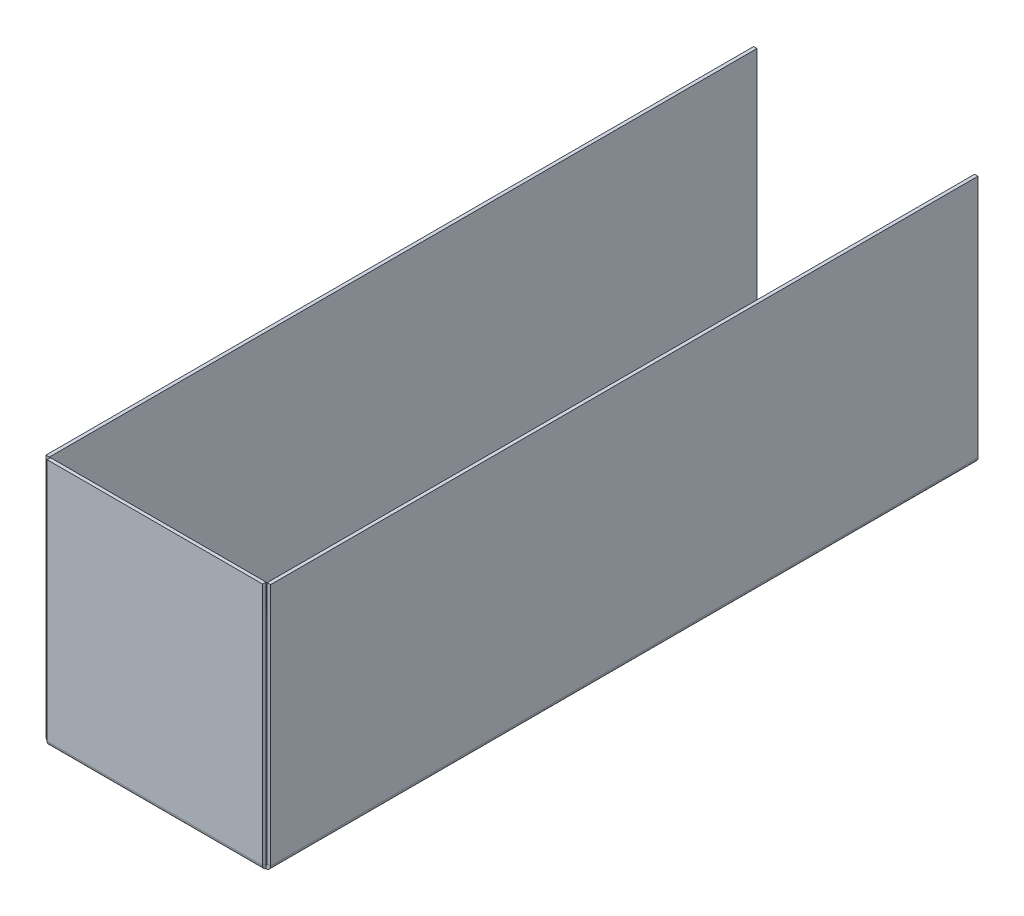
ISO-10303-21;
HEADER;
FILE_DESCRIPTION(('STEP AP214'),'2;1');
FILE_NAME('part.step','',(''),(''),'','','');
FILE_SCHEMA(('AUTOMOTIVE_DESIGN { 1 0 10303 214 1 1 1 1 }'));
ENDSEC;
DATA;
#1=APPLICATION_CONTEXT('core data for automotive mechanical design processes');
#2=APPLICATION_PROTOCOL_DEFINITION('international standard','automotive_design',2000,#1);
#3=PRODUCT_CONTEXT('',#1,'mechanical');
#4=PRODUCT('Part','Part','',(#3));
#5=PRODUCT_RELATED_PRODUCT_CATEGORY('part','',(#4));
#6=PRODUCT_DEFINITION_FORMATION('','',#4);
#7=PRODUCT_DEFINITION_CONTEXT('part definition',#1,'design');
#8=PRODUCT_DEFINITION('design','',#6,#7);
#9=PRODUCT_DEFINITION_SHAPE('','',#8);
#10=(LENGTH_UNIT() NAMED_UNIT(*) SI_UNIT(.MILLI.,.METRE.));
#11=(NAMED_UNIT(*) PLANE_ANGLE_UNIT() SI_UNIT($,.RADIAN.));
#12=(NAMED_UNIT(*) SI_UNIT($,.STERADIAN.) SOLID_ANGLE_UNIT());
#13=UNCERTAINTY_MEASURE_WITH_UNIT(LENGTH_MEASURE(1.E-05),#10,'distance_accuracy_value','');
#14=(GEOMETRIC_REPRESENTATION_CONTEXT(3) GLOBAL_UNCERTAINTY_ASSIGNED_CONTEXT((#13)) GLOBAL_UNIT_ASSIGNED_CONTEXT((#10,
#11,#12)) REPRESENTATION_CONTEXT('',''));
#15=CARTESIAN_POINT('',(0.,0.,0.));
#16=DIRECTION('',(0.,0.,1.));
#17=DIRECTION('',(1.,0.,0.));
#18=AXIS2_PLACEMENT_3D('',#15,#16,#17);
#19=CARTESIAN_POINT('',(167.362147713562,0.,660.4));
#20=DIRECTION('',(-1.,0.,0.));
#21=DIRECTION('',(0.,0.,1.));
#22=AXIS2_PLACEMENT_3D('',#19,#20,#21);
#23=PLANE('',#22);
#24=DIRECTION('',(0.,1.,0.));
#25=VECTOR('',#24,1.);
#26=CARTESIAN_POINT('',(167.362147713562,-3.175,660.4));
#27=LINE('',#26,#25);
#28=CARTESIAN_POINT('',(167.362147713562,-3.175,660.4));
#29=VERTEX_POINT('',#28);
#30=CARTESIAN_POINT('',(167.362147713562,-3.0534707350615,660.4));
#31=VERTEX_POINT('',#30);
#32=EDGE_CURVE('E228',#29,#31,#27,.T.);
#33=ORIENTED_EDGE('',*,*,#32,.T.);
#34=CARTESIAN_POINT('',(167.362147713562,1.,659.4));
#35=DIRECTION('',(1.,0.,0.));
#36=DIRECTION('',(0.,0.,-1.));
#37=AXIS2_PLACEMENT_3D('',#34,#35,#36);
#38=CIRCLE('',#37,4.175);
#39=CARTESIAN_POINT('',(167.362147713562,-3.175,659.4));
#40=VERTEX_POINT('',#39);
#41=EDGE_CURVE('E11',#31,#40,#38,.T.);
#42=ORIENTED_EDGE('',*,*,#41,.T.);
#43=DIRECTION('',(0.,0.,-1.));
#44=VECTOR('',#43,1.);
#45=CARTESIAN_POINT('',(167.362147713562,-3.175,660.4));
#46=LINE('',#45,#44);
#47=EDGE_CURVE('E198',#29,#40,#46,.T.);
#48=ORIENTED_EDGE('',*,*,#47,.F.);
#49=EDGE_LOOP('',(#33,#42,#48));
#50=FACE_BOUND('',#49,.T.);
#51=ADVANCED_FACE('F36',(#50),#23,.T.);
#52=CARTESIAN_POINT('',(-33.8378522864379,0.,659.4));
#53=DIRECTION('',(1.,0.,0.));
#54=DIRECTION('',(0.,0.,-1.));
#55=AXIS2_PLACEMENT_3D('',#52,#53,#54);
#56=PLANE('',#55);
#57=DIRECTION('',(0.,0.,-1.));
#58=VECTOR('',#57,1.);
#59=CARTESIAN_POINT('',(-33.8378522864379,-3.175,660.4));
#60=LINE('',#59,#58);
#61=CARTESIAN_POINT('',(-33.8378522864379,-3.175,660.4));
#62=VERTEX_POINT('',#61);
#63=CARTESIAN_POINT('',(-33.8378522864379,-3.175,659.4));
#64=VERTEX_POINT('',#63);
#65=EDGE_CURVE('E201',#62,#64,#60,.T.);
#66=ORIENTED_EDGE('',*,*,#65,.T.);
#67=CARTESIAN_POINT('',(-33.8378522864379,1.,659.4));
#68=DIRECTION('',(1.,0.,0.));
#69=DIRECTION('',(0.,0.,-1.));
#70=AXIS2_PLACEMENT_3D('',#67,#68,#69);
#71=CIRCLE('',#70,4.175);
#72=CARTESIAN_POINT('',(-33.8378522864379,-3.0534707350615,660.4));
#73=VERTEX_POINT('',#72);
#74=EDGE_CURVE('E168',#64,#73,#71,.F.);
#75=ORIENTED_EDGE('',*,*,#74,.T.);
#76=DIRECTION('',(0.,-1.,0.));
#77=VECTOR('',#76,1.);
#78=CARTESIAN_POINT('',(-33.8378522864379,0.,660.4));
#79=LINE('',#78,#77);
#80=EDGE_CURVE('E237',#73,#62,#79,.T.);
#81=ORIENTED_EDGE('',*,*,#80,.T.);
#82=EDGE_LOOP('',(#66,#75,#81));
#83=FACE_BOUND('',#82,.T.);
#84=ADVANCED_FACE('F272',(#83),#56,.T.);
#85=CARTESIAN_POINT('',(-34.8378522864379,0.,660.4));
#86=DIRECTION('',(0.,1.,0.));
#87=DIRECTION('',(0.,0.,1.));
#88=AXIS2_PLACEMENT_3D('',#85,#86,#87);
#89=PLANE('',#88);
#90=DIRECTION('',(0.,0.,-1.));
#91=VECTOR('',#90,1.);
#92=CARTESIAN_POINT('',(-33.8378522864379,0.,660.4));
#93=LINE('',#92,#91);
#94=CARTESIAN_POINT('',(-33.8378522864379,0.,659.4));
#95=VERTEX_POINT('',#94);
#96=CARTESIAN_POINT('',(-33.8378522864379,0.,0.));
#97=VERTEX_POINT('',#96);
#98=EDGE_CURVE('E209',#95,#97,#93,.T.);
#99=ORIENTED_EDGE('',*,*,#98,.F.);
#100=DIRECTION('',(1.,0.,0.));
#101=VECTOR('',#100,1.);
#102=CARTESIAN_POINT('',(167.362147713562,0.,659.4));
#103=LINE('',#102,#101);
#104=CARTESIAN_POINT('',(167.362147713562,0.,659.4));
#105=VERTEX_POINT('',#104);
#106=EDGE_CURVE('E301',#105,#95,#103,.F.);
#107=ORIENTED_EDGE('',*,*,#106,.F.);
#108=DIRECTION('',(0.,0.,-1.));
#109=VECTOR('',#108,1.);
#110=CARTESIAN_POINT('',(167.362147713562,0.,660.4));
#111=LINE('',#110,#109);
#112=CARTESIAN_POINT('',(167.362147713562,0.,0.));
#113=VERTEX_POINT('',#112);
#114=EDGE_CURVE('E213',#105,#113,#111,.T.);
#115=ORIENTED_EDGE('',*,*,#114,.T.);
#116=DIRECTION('',(1.,0.,0.));
#117=VECTOR('',#116,1.);
#118=CARTESIAN_POINT('',(-34.8378522864379,0.,0.));
#119=LINE('',#118,#117);
#120=EDGE_CURVE('E176',#97,#113,#119,.T.);
#121=ORIENTED_EDGE('',*,*,#120,.F.);
#122=EDGE_LOOP('',(#99,#107,#115,#121));
#123=FACE_BOUND('',#122,.T.);
#124=ADVANCED_FACE('F294',(#123),#89,.T.);
#125=CARTESIAN_POINT('',(-34.8378522864379,-3.175,660.4));
#126=DIRECTION('',(0.,1.,0.));
#127=DIRECTION('',(0.,0.,1.));
#128=AXIS2_PLACEMENT_3D('',#125,#126,#127);
#129=PLANE('',#128);
#130=DIRECTION('',(1.,0.,0.));
#131=VECTOR('',#130,1.);
#132=CARTESIAN_POINT('',(167.362147713562,-3.175,659.4));
#133=LINE('',#132,#131);
#134=EDGE_CURVE('E270',#40,#64,#133,.F.);
#135=ORIENTED_EDGE('',*,*,#134,.T.);
#136=CARTESIAN_POINT('',(-33.8378522864379,-3.175,0.));
#137=VERTEX_POINT('',#136);
#138=EDGE_CURVE('E200',#64,#137,#60,.T.);
#139=ORIENTED_EDGE('',*,*,#138,.T.);
#140=DIRECTION('',(1.,0.,0.));
#141=VECTOR('',#140,1.);
#142=CARTESIAN_POINT('',(-34.8378522864379,-3.175,0.));
#143=LINE('',#142,#141);
#144=CARTESIAN_POINT('',(167.362147713562,-3.175,0.));
#145=VERTEX_POINT('',#144);
#146=EDGE_CURVE('E191',#137,#145,#143,.T.);
#147=ORIENTED_EDGE('',*,*,#146,.T.);
#148=EDGE_CURVE('E98',#40,#145,#46,.T.);
#149=ORIENTED_EDGE('',*,*,#148,.F.);
#150=EDGE_LOOP('',(#135,#139,#147,#149));
#151=FACE_BOUND('',#150,.T.);
#152=ADVANCED_FACE('F285',(#151),#129,.F.);
#153=CARTESIAN_POINT('',(-33.8378522864379,0.,660.4));
#154=DIRECTION('',(0.,0.,1.));
#155=DIRECTION('',(1.,0.,0.));
#156=AXIS2_PLACEMENT_3D('',#153,#154,#155);
#157=PLANE('',#156);
#158=CARTESIAN_POINT('',(-33.8378522864379,0.,660.4));
#159=VERTEX_POINT('',#158);
#160=EDGE_CURVE('E40',#159,#73,#79,.T.);
#161=ORIENTED_EDGE('',*,*,#160,.F.);
#162=CARTESIAN_POINT('',(-33.8378522864379,1.,660.4));
#163=DIRECTION('',(0.,0.,-1.));
#164=DIRECTION('',(-1.,0.,0.));
#165=AXIS2_PLACEMENT_3D('',#162,#163,#164);
#166=CIRCLE('',#165,1.);
#167=CARTESIAN_POINT('',(-34.8378522864379,1.,660.4));
#168=VERTEX_POINT('',#167);
#169=EDGE_CURVE('E155',#168,#159,#166,.F.);
#170=ORIENTED_EDGE('',*,*,#169,.F.);
#171=DIRECTION('',(1.,0.,0.));
#172=VECTOR('',#171,1.);
#173=CARTESIAN_POINT('',(-38.0128522864379,1.,660.4));
#174=LINE('',#173,#172);
#175=CARTESIAN_POINT('',(-38.0128522864379,1.,660.4));
#176=VERTEX_POINT('',#175);
#177=EDGE_CURVE('E236',#176,#168,#174,.T.);
#178=ORIENTED_EDGE('',*,*,#177,.F.);
#179=CARTESIAN_POINT('',(-33.8378522864379,1.,660.4));
#180=DIRECTION('',(0.,0.,1.));
#181=DIRECTION('',(1.,0.,0.));
#182=AXIS2_PLACEMENT_3D('',#179,#180,#181);
#183=CIRCLE('',#182,4.175);
#184=EDGE_CURVE('E148',#176,#62,#183,.T.);
#185=ORIENTED_EDGE('',*,*,#184,.T.);
#186=ORIENTED_EDGE('',*,*,#80,.F.);
#187=EDGE_LOOP('',(#161,#170,#178,#185,#186));
#188=FACE_BOUND('',#187,.T.);
#189=ADVANCED_FACE('F38',(#188),#157,.T.);
#190=CARTESIAN_POINT('',(-34.8378522864379,1.,0.));
#191=DIRECTION('',(0.,0.,-1.));
#192=DIRECTION('',(-1.,0.,0.));
#193=AXIS2_PLACEMENT_3D('',#190,#191,#192);
#194=PLANE('',#193);
#195=DIRECTION('',(-1.,0.,0.));
#196=VECTOR('',#195,1.);
#197=CARTESIAN_POINT('',(-34.8378522864379,1.,0.));
#198=LINE('',#197,#196);
#199=CARTESIAN_POINT('',(-34.8378522864379,1.,0.));
#200=VERTEX_POINT('',#199);
#201=CARTESIAN_POINT('',(-38.0128522864379,1.,0.));
#202=VERTEX_POINT('',#201);
#203=EDGE_CURVE('E235',#200,#202,#198,.T.);
#204=ORIENTED_EDGE('',*,*,#203,.F.);
#205=CARTESIAN_POINT('',(-33.8378522864379,1.,0.));
#206=DIRECTION('',(0.,0.,-1.));
#207=DIRECTION('',(-1.,0.,0.));
#208=AXIS2_PLACEMENT_3D('',#205,#206,#207);
#209=CIRCLE('',#208,1.);
#210=EDGE_CURVE('E179',#200,#97,#209,.F.);
#211=ORIENTED_EDGE('',*,*,#210,.T.);
#212=DIRECTION('',(0.,1.,0.));
#213=VECTOR('',#212,1.);
#214=CARTESIAN_POINT('',(-33.8378522864379,-3.175,0.));
#215=LINE('',#214,#213);
#216=EDGE_CURVE('E232',#137,#97,#215,.T.);
#217=ORIENTED_EDGE('',*,*,#216,.F.);
#218=CARTESIAN_POINT('',(-33.8378522864379,1.,0.));
#219=DIRECTION('',(0.,0.,1.));
#220=DIRECTION('',(1.,0.,0.));
#221=AXIS2_PLACEMENT_3D('',#218,#219,#220);
#222=CIRCLE('',#221,4.175);
#223=EDGE_CURVE('E188',#202,#137,#222,.T.);
#224=ORIENTED_EDGE('',*,*,#223,.F.);
#225=EDGE_LOOP('',(#204,#211,#217,#224));
#226=FACE_BOUND('',#225,.T.);
#227=ADVANCED_FACE('F287',(#226),#194,.T.);
#228=CARTESIAN_POINT('',(-33.8378522864379,-3.175,0.));
#229=DIRECTION('',(0.,0.,-1.));
#230=DIRECTION('',(-1.,0.,0.));
#231=AXIS2_PLACEMENT_3D('',#228,#229,#230);
#232=PLANE('',#231);
#233=DIRECTION('',(0.,-1.,0.));
#234=VECTOR('',#233,1.);
#235=CARTESIAN_POINT('',(-34.8378522864379,228.6,0.));
#236=LINE('',#235,#234);
#237=CARTESIAN_POINT('',(-34.8378522864379,228.6,0.));
#238=VERTEX_POINT('',#237);
#239=EDGE_CURVE('E182',#238,#200,#236,.T.);
#240=ORIENTED_EDGE('',*,*,#239,.T.);
#241=ORIENTED_EDGE('',*,*,#203,.T.);
#242=DIRECTION('',(0.,-1.,0.));
#243=VECTOR('',#242,1.);
#244=CARTESIAN_POINT('',(-38.0128522864379,228.6,0.));
#245=LINE('',#244,#243);
#246=CARTESIAN_POINT('',(-38.0128522864379,228.6,0.));
#247=VERTEX_POINT('',#246);
#248=EDGE_CURVE('E186',#247,#202,#245,.T.);
#249=ORIENTED_EDGE('',*,*,#248,.F.);
#250=DIRECTION('',(1.,0.,0.));
#251=VECTOR('',#250,1.);
#252=CARTESIAN_POINT('',(-38.0128522864379,228.6,0.));
#253=LINE('',#252,#251);
#254=EDGE_CURVE('E134',#247,#238,#253,.T.);
#255=ORIENTED_EDGE('',*,*,#254,.T.);
#256=EDGE_LOOP('',(#240,#241,#249,#255));
#257=FACE_BOUND('',#256,.T.);
#258=ADVANCED_FACE('F367',(#257),#232,.T.);
#259=CARTESIAN_POINT('',(168.362147713562,1.,660.4));
#260=DIRECTION('',(0.,0.,1.));
#261=DIRECTION('',(1.,0.,0.));
#262=AXIS2_PLACEMENT_3D('',#259,#260,#261);
#263=PLANE('',#262);
#264=DIRECTION('',(1.,0.,0.));
#265=VECTOR('',#264,1.);
#266=CARTESIAN_POINT('',(168.362147713562,1.,660.4));
#267=LINE('',#266,#265);
#268=CARTESIAN_POINT('',(168.362147713562,1.,660.4));
#269=VERTEX_POINT('',#268);
#270=CARTESIAN_POINT('',(171.537147713562,1.,660.4));
#271=VERTEX_POINT('',#270);
#272=EDGE_CURVE('E55',#269,#271,#267,.T.);
#273=ORIENTED_EDGE('',*,*,#272,.F.);
#274=CARTESIAN_POINT('',(167.362147713562,1.,660.4));
#275=DIRECTION('',(0.,0.,-1.));
#276=DIRECTION('',(-1.,0.,0.));
#277=AXIS2_PLACEMENT_3D('',#274,#275,#276);
#278=CIRCLE('',#277,1.);
#279=CARTESIAN_POINT('',(167.362147713562,0.,660.4));
#280=VERTEX_POINT('',#279);
#281=EDGE_CURVE('E311',#280,#269,#278,.F.);
#282=ORIENTED_EDGE('',*,*,#281,.F.);
#283=EDGE_CURVE('E227',#31,#280,#27,.T.);
#284=ORIENTED_EDGE('',*,*,#283,.F.);
#285=ORIENTED_EDGE('',*,*,#32,.F.);
#286=CARTESIAN_POINT('',(167.362147713562,1.,660.4));
#287=DIRECTION('',(0.,0.,1.));
#288=DIRECTION('',(1.,0.,0.));
#289=AXIS2_PLACEMENT_3D('',#286,#287,#288);
#290=CIRCLE('',#289,4.175);
#291=EDGE_CURVE('E161',#29,#271,#290,.T.);
#292=ORIENTED_EDGE('',*,*,#291,.T.);
#293=EDGE_LOOP('',(#273,#282,#284,#285,#292));
#294=FACE_BOUND('',#293,.T.);
#295=ADVANCED_FACE('F328',(#294),#263,.T.);
#296=CARTESIAN_POINT('',(167.362147713562,-3.175,660.4));
#297=DIRECTION('',(0.,0.,1.));
#298=DIRECTION('',(1.,0.,0.));
#299=AXIS2_PLACEMENT_3D('',#296,#297,#298);
#300=PLANE('',#299);
#301=DIRECTION('',(0.,1.,0.));
#302=VECTOR('',#301,1.);
#303=CARTESIAN_POINT('',(168.362147713562,0.,660.4));
#304=LINE('',#303,#302);
#305=CARTESIAN_POINT('',(168.362147713562,228.6,660.4));
#306=VERTEX_POINT('',#305);
#307=EDGE_CURVE('E359',#269,#306,#304,.T.);
#308=ORIENTED_EDGE('',*,*,#307,.F.);
#309=ORIENTED_EDGE('',*,*,#272,.T.);
#310=DIRECTION('',(0.,1.,0.));
#311=VECTOR('',#310,1.);
#312=CARTESIAN_POINT('',(171.537147713562,0.,660.4));
#313=LINE('',#312,#311);
#314=CARTESIAN_POINT('',(171.537147713562,228.6,660.4));
#315=VERTEX_POINT('',#314);
#316=EDGE_CURVE('E110',#271,#315,#313,.T.);
#317=ORIENTED_EDGE('',*,*,#316,.T.);
#318=DIRECTION('',(1.,0.,0.));
#319=VECTOR('',#318,1.);
#320=CARTESIAN_POINT('',(168.362147713562,228.6,660.4));
#321=LINE('',#320,#319);
#322=EDGE_CURVE('E357',#306,#315,#321,.T.);
#323=ORIENTED_EDGE('',*,*,#322,.F.);
#324=EDGE_LOOP('',(#308,#309,#317,#323));
#325=FACE_BOUND('',#324,.T.);
#326=ADVANCED_FACE('F374',(#325),#300,.T.);
#327=CARTESIAN_POINT('',(167.362147713562,0.,0.));
#328=DIRECTION('',(0.,0.,-1.));
#329=DIRECTION('',(-1.,0.,0.));
#330=AXIS2_PLACEMENT_3D('',#327,#328,#329);
#331=PLANE('',#330);
#332=DIRECTION('',(0.,-1.,0.));
#333=VECTOR('',#332,1.);
#334=CARTESIAN_POINT('',(167.362147713562,0.,0.));
#335=LINE('',#334,#333);
#336=EDGE_CURVE('E225',#113,#145,#335,.T.);
#337=ORIENTED_EDGE('',*,*,#336,.F.);
#338=CARTESIAN_POINT('',(167.362147713562,1.,0.));
#339=DIRECTION('',(0.,0.,-1.));
#340=DIRECTION('',(-1.,0.,0.));
#341=AXIS2_PLACEMENT_3D('',#338,#339,#340);
#342=CIRCLE('',#341,1.);
#343=CARTESIAN_POINT('',(168.362147713562,1.,0.));
#344=VERTEX_POINT('',#343);
#345=EDGE_CURVE('E174',#113,#344,#342,.F.);
#346=ORIENTED_EDGE('',*,*,#345,.T.);
#347=DIRECTION('',(-1.,0.,0.));
#348=VECTOR('',#347,1.);
#349=CARTESIAN_POINT('',(171.537147713562,1.,0.));
#350=LINE('',#349,#348);
#351=CARTESIAN_POINT('',(171.537147713562,1.,0.));
#352=VERTEX_POINT('',#351);
#353=EDGE_CURVE('E105',#352,#344,#350,.T.);
#354=ORIENTED_EDGE('',*,*,#353,.F.);
#355=CARTESIAN_POINT('',(167.362147713562,1.,0.));
#356=DIRECTION('',(0.,0.,1.));
#357=DIRECTION('',(1.,0.,0.));
#358=AXIS2_PLACEMENT_3D('',#355,#356,#357);
#359=CIRCLE('',#358,4.175);
#360=EDGE_CURVE('E194',#145,#352,#359,.T.);
#361=ORIENTED_EDGE('',*,*,#360,.F.);
#362=EDGE_LOOP('',(#337,#346,#354,#361));
#363=FACE_BOUND('',#362,.T.);
#364=ADVANCED_FACE('F305',(#363),#331,.T.);
#365=CARTESIAN_POINT('',(171.537147713562,1.,0.));
#366=DIRECTION('',(0.,0.,-1.));
#367=DIRECTION('',(-1.,0.,0.));
#368=AXIS2_PLACEMENT_3D('',#365,#366,#367);
#369=PLANE('',#368);
#370=ORIENTED_EDGE('',*,*,#120,.T.);
#371=ORIENTED_EDGE('',*,*,#336,.T.);
#372=ORIENTED_EDGE('',*,*,#146,.F.);
#373=ORIENTED_EDGE('',*,*,#216,.T.);
#374=EDGE_LOOP('',(#370,#371,#372,#373));
#375=FACE_BOUND('',#374,.T.);
#376=ADVANCED_FACE('F291',(#375),#369,.T.);
#377=CARTESIAN_POINT('',(171.537147713562,0.,660.4));
#378=DIRECTION('',(-1.,0.,0.));
#379=DIRECTION('',(0.,0.,1.));
#380=AXIS2_PLACEMENT_3D('',#377,#378,#379);
#381=PLANE('',#380);
#382=DIRECTION('',(0.,1.,0.));
#383=VECTOR('',#382,1.);
#384=CARTESIAN_POINT('',(171.537147713562,0.,0.));
#385=LINE('',#384,#383);
#386=CARTESIAN_POINT('',(171.537147713562,228.6,0.));
#387=VERTEX_POINT('',#386);
#388=EDGE_CURVE('E164',#352,#387,#385,.T.);
#389=ORIENTED_EDGE('',*,*,#388,.T.);
#390=DIRECTION('',(0.,0.,-1.));
#391=VECTOR('',#390,1.);
#392=CARTESIAN_POINT('',(171.537147713562,228.6,660.4));
#393=LINE('',#392,#391);
#394=EDGE_CURVE('E222',#315,#387,#393,.T.);
#395=ORIENTED_EDGE('',*,*,#394,.F.);
#396=ORIENTED_EDGE('',*,*,#316,.F.);
#397=DIRECTION('',(0.,0.,-1.));
#398=VECTOR('',#397,1.);
#399=CARTESIAN_POINT('',(171.537147713562,1.,660.4));
#400=LINE('',#399,#398);
#401=EDGE_CURVE('E163',#271,#352,#400,.T.);
#402=ORIENTED_EDGE('',*,*,#401,.T.);
#403=EDGE_LOOP('',(#389,#395,#396,#402));
#404=FACE_BOUND('',#403,.T.);
#405=ADVANCED_FACE('F320',(#404),#381,.F.);
#406=CARTESIAN_POINT('',(168.362147713562,228.6,660.4));
#407=DIRECTION('',(0.,1.,0.));
#408=DIRECTION('',(0.,0.,1.));
#409=AXIS2_PLACEMENT_3D('',#406,#407,#408);
#410=PLANE('',#409);
#411=DIRECTION('',(1.,0.,0.));
#412=VECTOR('',#411,1.);
#413=CARTESIAN_POINT('',(168.362147713562,228.6,0.));
#414=LINE('',#413,#412);
#415=CARTESIAN_POINT('',(168.362147713562,228.6,0.));
#416=VERTEX_POINT('',#415);
#417=EDGE_CURVE('E167',#416,#387,#414,.T.);
#418=ORIENTED_EDGE('',*,*,#417,.F.);
#419=DIRECTION('',(0.,0.,-1.));
#420=VECTOR('',#419,1.);
#421=CARTESIAN_POINT('',(168.362147713562,228.6,660.4));
#422=LINE('',#421,#420);
#423=EDGE_CURVE('E220',#306,#416,#422,.T.);
#424=ORIENTED_EDGE('',*,*,#423,.F.);
#425=ORIENTED_EDGE('',*,*,#322,.T.);
#426=ORIENTED_EDGE('',*,*,#394,.T.);
#427=EDGE_LOOP('',(#418,#424,#425,#426));
#428=FACE_BOUND('',#427,.T.);
#429=ADVANCED_FACE('F408',(#428),#410,.T.);
#430=CARTESIAN_POINT('',(168.362147713562,0.,660.4));
#431=DIRECTION('',(-1.,0.,0.));
#432=DIRECTION('',(0.,0.,1.));
#433=AXIS2_PLACEMENT_3D('',#430,#431,#432);
#434=PLANE('',#433);
#435=DIRECTION('',(0.,1.,0.));
#436=VECTOR('',#435,1.);
#437=CARTESIAN_POINT('',(168.362147713562,0.,0.));
#438=LINE('',#437,#436);
#439=EDGE_CURVE('E171',#344,#416,#438,.T.);
#440=ORIENTED_EDGE('',*,*,#439,.F.);
#441=DIRECTION('',(0.,0.,-1.));
#442=VECTOR('',#441,1.);
#443=CARTESIAN_POINT('',(168.362147713562,1.,660.4));
#444=LINE('',#443,#442);
#445=EDGE_CURVE('E217',#269,#344,#444,.T.);
#446=ORIENTED_EDGE('',*,*,#445,.F.);
#447=ORIENTED_EDGE('',*,*,#307,.T.);
#448=ORIENTED_EDGE('',*,*,#423,.T.);
#449=EDGE_LOOP('',(#440,#446,#447,#448));
#450=FACE_BOUND('',#449,.T.);
#451=ADVANCED_FACE('F314',(#450),#434,.T.);
#452=CARTESIAN_POINT('',(167.362147713562,1.,660.4));
#453=DIRECTION('',(0.,0.,-1.));
#454=DIRECTION('',(-1.,0.,0.));
#455=AXIS2_PLACEMENT_3D('',#452,#453,#454);
#456=CYLINDRICAL_SURFACE('',#455,1.);
#457=ORIENTED_EDGE('',*,*,#345,.F.);
#458=ORIENTED_EDGE('',*,*,#114,.F.);
#459=EDGE_CURVE('E214',#280,#105,#111,.T.);
#460=ORIENTED_EDGE('',*,*,#459,.F.);
#461=ORIENTED_EDGE('',*,*,#281,.T.);
#462=ORIENTED_EDGE('',*,*,#445,.T.);
#463=EDGE_LOOP('',(#457,#458,#460,#461,#462));
#464=FACE_BOUND('',#463,.T.);
#465=ADVANCED_FACE('F306',(#464),#456,.F.);
#466=CARTESIAN_POINT('',(-33.8378522864379,1.,660.4));
#467=DIRECTION('',(0.,0.,-1.));
#468=DIRECTION('',(-1.,0.,0.));
#469=AXIS2_PLACEMENT_3D('',#466,#467,#468);
#470=CYLINDRICAL_SURFACE('',#469,1.);
#471=ORIENTED_EDGE('',*,*,#210,.F.);
#472=DIRECTION('',(0.,0.,-1.));
#473=VECTOR('',#472,1.);
#474=CARTESIAN_POINT('',(-34.8378522864379,1.,660.4));
#475=LINE('',#474,#473);
#476=EDGE_CURVE('E206',#168,#200,#475,.T.);
#477=ORIENTED_EDGE('',*,*,#476,.F.);
#478=ORIENTED_EDGE('',*,*,#169,.T.);
#479=EDGE_CURVE('E210',#159,#95,#93,.T.);
#480=ORIENTED_EDGE('',*,*,#479,.T.);
#481=ORIENTED_EDGE('',*,*,#98,.T.);
#482=EDGE_LOOP('',(#471,#477,#478,#480,#481));
#483=FACE_BOUND('',#482,.T.);
#484=ADVANCED_FACE('F362',(#483),#470,.F.);
#485=CARTESIAN_POINT('',(-34.8378522864379,228.6,660.4));
#486=DIRECTION('',(1.,0.,0.));
#487=DIRECTION('',(0.,1.,0.));
#488=AXIS2_PLACEMENT_3D('',#485,#486,#487);
#489=PLANE('',#488);
#490=ORIENTED_EDGE('',*,*,#239,.F.);
#491=DIRECTION('',(0.,0.,-1.));
#492=VECTOR('',#491,1.);
#493=CARTESIAN_POINT('',(-34.8378522864379,228.6,660.4));
#494=LINE('',#493,#492);
#495=CARTESIAN_POINT('',(-34.8378522864379,228.6,660.4));
#496=VERTEX_POINT('',#495);
#497=EDGE_CURVE('E138',#496,#238,#494,.T.);
#498=ORIENTED_EDGE('',*,*,#497,.F.);
#499=DIRECTION('',(0.,-1.,0.));
#500=VECTOR('',#499,1.);
#501=CARTESIAN_POINT('',(-34.8378522864379,228.6,660.4));
#502=LINE('',#501,#500);
#503=EDGE_CURVE('E153',#496,#168,#502,.T.);
#504=ORIENTED_EDGE('',*,*,#503,.T.);
#505=ORIENTED_EDGE('',*,*,#476,.T.);
#506=EDGE_LOOP('',(#490,#498,#504,#505));
#507=FACE_BOUND('',#506,.T.);
#508=ADVANCED_FACE('F365',(#507),#489,.T.);
#509=CARTESIAN_POINT('',(-38.0128522864379,228.6,660.4));
#510=DIRECTION('',(0.,1.,0.));
#511=DIRECTION('',(0.,0.,1.));
#512=AXIS2_PLACEMENT_3D('',#509,#510,#511);
#513=PLANE('',#512);
#514=ORIENTED_EDGE('',*,*,#254,.F.);
#515=DIRECTION('',(0.,0.,-1.));
#516=VECTOR('',#515,1.);
#517=CARTESIAN_POINT('',(-38.0128522864379,228.6,660.4));
#518=LINE('',#517,#516);
#519=CARTESIAN_POINT('',(-38.0128522864379,228.6,660.4));
#520=VERTEX_POINT('',#519);
#521=EDGE_CURVE('E128',#520,#247,#518,.T.);
#522=ORIENTED_EDGE('',*,*,#521,.F.);
#523=DIRECTION('',(1.,0.,0.));
#524=VECTOR('',#523,1.);
#525=CARTESIAN_POINT('',(-38.0128522864379,228.6,660.4));
#526=LINE('',#525,#524);
#527=EDGE_CURVE('E132',#520,#496,#526,.T.);
#528=ORIENTED_EDGE('',*,*,#527,.T.);
#529=ORIENTED_EDGE('',*,*,#497,.T.);
#530=EDGE_LOOP('',(#514,#522,#528,#529));
#531=FACE_BOUND('',#530,.T.);
#532=ADVANCED_FACE('F130',(#531),#513,.T.);
#533=CARTESIAN_POINT('',(-38.0128522864379,228.6,660.4));
#534=DIRECTION('',(1.,0.,0.));
#535=DIRECTION('',(0.,1.,0.));
#536=AXIS2_PLACEMENT_3D('',#533,#534,#535);
#537=PLANE('',#536);
#538=ORIENTED_EDGE('',*,*,#248,.T.);
#539=DIRECTION('',(0.,0.,-1.));
#540=VECTOR('',#539,1.);
#541=CARTESIAN_POINT('',(-38.0128522864379,1.,660.4));
#542=LINE('',#541,#540);
#543=EDGE_CURVE('E139',#176,#202,#542,.T.);
#544=ORIENTED_EDGE('',*,*,#543,.F.);
#545=DIRECTION('',(0.,-1.,0.));
#546=VECTOR('',#545,1.);
#547=CARTESIAN_POINT('',(-38.0128522864379,228.6,660.4));
#548=LINE('',#547,#546);
#549=EDGE_CURVE('E143',#520,#176,#548,.T.);
#550=ORIENTED_EDGE('',*,*,#549,.F.);
#551=ORIENTED_EDGE('',*,*,#521,.T.);
#552=EDGE_LOOP('',(#538,#544,#550,#551));
#553=FACE_BOUND('',#552,.T.);
#554=ADVANCED_FACE('F144',(#553),#537,.F.);
#555=CARTESIAN_POINT('',(-33.8378522864379,1.,660.4));
#556=DIRECTION('',(0.,0.,-1.));
#557=DIRECTION('',(-1.,0.,0.));
#558=AXIS2_PLACEMENT_3D('',#555,#556,#557);
#559=CYLINDRICAL_SURFACE('',#558,4.175);
#560=ORIENTED_EDGE('',*,*,#223,.T.);
#561=ORIENTED_EDGE('',*,*,#138,.F.);
#562=ORIENTED_EDGE('',*,*,#65,.F.);
#563=ORIENTED_EDGE('',*,*,#184,.F.);
#564=ORIENTED_EDGE('',*,*,#543,.T.);
#565=EDGE_LOOP('',(#560,#561,#562,#563,#564));
#566=FACE_BOUND('',#565,.T.);
#567=ADVANCED_FACE('F278',(#566),#559,.T.);
#568=CARTESIAN_POINT('',(167.362147713562,1.,660.4));
#569=DIRECTION('',(0.,0.,-1.));
#570=DIRECTION('',(-1.,0.,0.));
#571=AXIS2_PLACEMENT_3D('',#568,#569,#570);
#572=CYLINDRICAL_SURFACE('',#571,4.175);
#573=ORIENTED_EDGE('',*,*,#360,.T.);
#574=ORIENTED_EDGE('',*,*,#401,.F.);
#575=ORIENTED_EDGE('',*,*,#291,.F.);
#576=ORIENTED_EDGE('',*,*,#47,.T.);
#577=ORIENTED_EDGE('',*,*,#148,.T.);
#578=EDGE_LOOP('',(#573,#574,#575,#576,#577));
#579=FACE_BOUND('',#578,.T.);
#580=ADVANCED_FACE('F324',(#579),#572,.T.);
#581=CARTESIAN_POINT('',(167.362147713562,1.,660.4));
#582=DIRECTION('',(0.,0.,-1.));
#583=DIRECTION('',(-1.,0.,0.));
#584=AXIS2_PLACEMENT_3D('',#581,#582,#583);
#585=PLANE('',#584);
#586=ORIENTED_EDGE('',*,*,#549,.T.);
#587=ORIENTED_EDGE('',*,*,#177,.T.);
#588=ORIENTED_EDGE('',*,*,#503,.F.);
#589=ORIENTED_EDGE('',*,*,#527,.F.);
#590=EDGE_LOOP('',(#586,#587,#588,#589));
#591=FACE_BOUND('',#590,.T.);
#592=ADVANCED_FACE('F151',(#591),#585,.F.);
#593=CARTESIAN_POINT('',(167.362147713562,1.,0.));
#594=DIRECTION('',(0.,0.,-1.));
#595=DIRECTION('',(-1.,0.,0.));
#596=AXIS2_PLACEMENT_3D('',#593,#594,#595);
#597=PLANE('',#596);
#598=ORIENTED_EDGE('',*,*,#388,.F.);
#599=ORIENTED_EDGE('',*,*,#353,.T.);
#600=ORIENTED_EDGE('',*,*,#439,.T.);
#601=ORIENTED_EDGE('',*,*,#417,.T.);
#602=EDGE_LOOP('',(#598,#599,#600,#601));
#603=FACE_BOUND('',#602,.T.);
#604=ADVANCED_FACE('F318',(#603),#597,.T.);
#605=CARTESIAN_POINT('',(-33.8378522864379,1.,659.4));
#606=DIRECTION('',(-1.,0.,0.));
#607=DIRECTION('',(0.,0.,1.));
#608=AXIS2_PLACEMENT_3D('',#605,#606,#607);
#609=PLANE('',#608);
#610=ORIENTED_EDGE('',*,*,#479,.F.);
#611=ORIENTED_EDGE('',*,*,#160,.T.);
#612=CARTESIAN_POINT('',(-33.8378522864379,1.,663.575));
#613=VERTEX_POINT('',#612);
#614=EDGE_CURVE('E253',#73,#613,#71,.F.);
#615=ORIENTED_EDGE('',*,*,#614,.T.);
#616=DIRECTION('',(0.,0.,1.));
#617=VECTOR('',#616,1.);
#618=CARTESIAN_POINT('',(-33.8378522864379,1.,660.4));
#619=LINE('',#618,#617);
#620=CARTESIAN_POINT('',(-33.8378522864379,1.,660.4));
#621=VERTEX_POINT('',#620);
#622=EDGE_CURVE('E343',#621,#613,#619,.T.);
#623=ORIENTED_EDGE('',*,*,#622,.F.);
#624=CARTESIAN_POINT('',(-33.8378522864379,1.,659.4));
#625=DIRECTION('',(1.,0.,0.));
#626=DIRECTION('',(0.,0.,-1.));
#627=AXIS2_PLACEMENT_3D('',#624,#625,#626);
#628=CIRCLE('',#627,1.);
#629=EDGE_CURVE('E341',#95,#621,#628,.F.);
#630=ORIENTED_EDGE('',*,*,#629,.F.);
#631=EDGE_LOOP('',(#610,#611,#615,#623,#630));
#632=FACE_BOUND('',#631,.T.);
#633=ADVANCED_FACE('F250',(#632),#609,.T.);
#634=CARTESIAN_POINT('',(167.362147713562,1.,659.4));
#635=DIRECTION('',(-1.,0.,0.));
#636=DIRECTION('',(0.,0.,1.));
#637=AXIS2_PLACEMENT_3D('',#634,#635,#636);
#638=PLANE('',#637);
#639=CARTESIAN_POINT('',(167.362147713562,1.,663.575));
#640=VERTEX_POINT('',#639);
#641=EDGE_CURVE('E47',#640,#31,#38,.T.);
#642=ORIENTED_EDGE('',*,*,#641,.T.);
#643=ORIENTED_EDGE('',*,*,#283,.T.);
#644=ORIENTED_EDGE('',*,*,#459,.T.);
#645=CARTESIAN_POINT('',(167.362147713562,1.,659.4));
#646=DIRECTION('',(1.,0.,0.));
#647=DIRECTION('',(0.,0.,-1.));
#648=AXIS2_PLACEMENT_3D('',#645,#646,#647);
#649=CIRCLE('',#648,1.);
#650=CARTESIAN_POINT('',(167.362147713562,1.,660.4));
#651=VERTEX_POINT('',#650);
#652=EDGE_CURVE('E351',#651,#105,#649,.T.);
#653=ORIENTED_EDGE('',*,*,#652,.F.);
#654=DIRECTION('',(0.,0.,1.));
#655=VECTOR('',#654,1.);
#656=CARTESIAN_POINT('',(167.362147713562,1.,660.4));
#657=LINE('',#656,#655);
#658=EDGE_CURVE('E730',#651,#640,#657,.T.);
#659=ORIENTED_EDGE('',*,*,#658,.T.);
#660=EDGE_LOOP('',(#642,#643,#644,#653,#659));
#661=FACE_BOUND('',#660,.T.);
#662=ADVANCED_FACE('F485',(#661),#638,.F.);
#663=CARTESIAN_POINT('',(167.362147713562,1.,659.4));
#664=DIRECTION('',(1.,0.,0.));
#665=DIRECTION('',(0.,0.,1.));
#666=AXIS2_PLACEMENT_3D('',#663,#664,#665);
#667=CYLINDRICAL_SURFACE('',#666,4.175);
#668=ORIENTED_EDGE('',*,*,#134,.F.);
#669=ORIENTED_EDGE('',*,*,#41,.F.);
#670=ORIENTED_EDGE('',*,*,#641,.F.);
#671=DIRECTION('',(-1.,0.,0.));
#672=VECTOR('',#671,1.);
#673=CARTESIAN_POINT('',(0.,1.,663.575));
#674=LINE('',#673,#672);
#675=EDGE_CURVE('E268',#640,#613,#674,.T.);
#676=ORIENTED_EDGE('',*,*,#675,.T.);
#677=ORIENTED_EDGE('',*,*,#614,.F.);
#678=ORIENTED_EDGE('',*,*,#74,.F.);
#679=EDGE_LOOP('',(#668,#669,#670,#676,#677,#678));
#680=FACE_BOUND('',#679,.T.);
#681=ADVANCED_FACE('F265',(#680),#667,.T.);
#682=CARTESIAN_POINT('',(167.362147713562,1.,659.4));
#683=DIRECTION('',(1.,0.,0.));
#684=DIRECTION('',(0.,0.,1.));
#685=AXIS2_PLACEMENT_3D('',#682,#683,#684);
#686=CYLINDRICAL_SURFACE('',#685,1.);
#687=ORIENTED_EDGE('',*,*,#106,.T.);
#688=ORIENTED_EDGE('',*,*,#629,.T.);
#689=DIRECTION('',(1.,0.,0.));
#690=VECTOR('',#689,1.);
#691=CARTESIAN_POINT('',(-33.8378522864379,1.,660.4));
#692=LINE('',#691,#690);
#693=EDGE_CURVE('E726',#621,#651,#692,.T.);
#694=ORIENTED_EDGE('',*,*,#693,.T.);
#695=ORIENTED_EDGE('',*,*,#652,.T.);
#696=EDGE_LOOP('',(#687,#688,#694,#695));
#697=FACE_BOUND('',#696,.T.);
#698=ADVANCED_FACE('F349',(#697),#686,.F.);
#699=CARTESIAN_POINT('',(-33.8378522864379,0.,663.575));
#700=DIRECTION('',(1.,0.,0.));
#701=DIRECTION('',(0.,1.,0.));
#702=AXIS2_PLACEMENT_3D('',#699,#700,#701);
#703=PLANE('',#702);
#704=ORIENTED_EDGE('',*,*,#622,.T.);
#705=DIRECTION('',(0.,-1.,0.));
#706=VECTOR('',#705,1.);
#707=CARTESIAN_POINT('',(-33.8378522864379,0.,663.575));
#708=LINE('',#707,#706);
#709=CARTESIAN_POINT('',(-33.8378522864379,228.6,663.575));
#710=VERTEX_POINT('',#709);
#711=EDGE_CURVE('E718',#710,#613,#708,.T.);
#712=ORIENTED_EDGE('',*,*,#711,.F.);
#713=DIRECTION('',(0.,0.,-1.));
#714=VECTOR('',#713,1.);
#715=CARTESIAN_POINT('',(-33.8378522864379,228.6,663.575));
#716=LINE('',#715,#714);
#717=CARTESIAN_POINT('',(-33.8378522864379,228.6,660.4));
#718=VERTEX_POINT('',#717);
#719=EDGE_CURVE('E710',#710,#718,#716,.T.);
#720=ORIENTED_EDGE('',*,*,#719,.T.);
#721=DIRECTION('',(0.,-1.,0.));
#722=VECTOR('',#721,1.);
#723=CARTESIAN_POINT('',(-33.8378522864379,0.,660.4));
#724=LINE('',#723,#722);
#725=EDGE_CURVE('E722',#718,#621,#724,.T.);
#726=ORIENTED_EDGE('',*,*,#725,.T.);
#727=EDGE_LOOP('',(#704,#712,#720,#726));
#728=FACE_BOUND('',#727,.T.);
#729=ADVANCED_FACE('F504',(#728),#703,.F.);
#730=CARTESIAN_POINT('',(167.362147713562,228.6,663.575));
#731=DIRECTION('',(-1.,0.,0.));
#732=DIRECTION('',(0.,-1.,0.));
#733=AXIS2_PLACEMENT_3D('',#730,#731,#732);
#734=PLANE('',#733);
#735=ORIENTED_EDGE('',*,*,#658,.F.);
#736=DIRECTION('',(0.,1.,0.));
#737=VECTOR('',#736,1.);
#738=CARTESIAN_POINT('',(167.362147713562,228.6,660.4));
#739=LINE('',#738,#737);
#740=CARTESIAN_POINT('',(167.362147713562,228.6,660.4));
#741=VERTEX_POINT('',#740);
#742=EDGE_CURVE('E719',#651,#741,#739,.T.);
#743=ORIENTED_EDGE('',*,*,#742,.T.);
#744=DIRECTION('',(0.,0.,-1.));
#745=VECTOR('',#744,1.);
#746=CARTESIAN_POINT('',(167.362147713562,228.6,663.575));
#747=LINE('',#746,#745);
#748=CARTESIAN_POINT('',(167.362147713562,228.6,663.575));
#749=VERTEX_POINT('',#748);
#750=EDGE_CURVE('E353',#749,#741,#747,.T.);
#751=ORIENTED_EDGE('',*,*,#750,.F.);
#752=DIRECTION('',(0.,1.,0.));
#753=VECTOR('',#752,1.);
#754=CARTESIAN_POINT('',(167.362147713562,228.6,663.575));
#755=LINE('',#754,#753);
#756=EDGE_CURVE('E753',#640,#749,#755,.T.);
#757=ORIENTED_EDGE('',*,*,#756,.F.);
#758=EDGE_LOOP('',(#735,#743,#751,#757));
#759=FACE_BOUND('',#758,.T.);
#760=ADVANCED_FACE('F511',(#759),#734,.F.);
#761=CARTESIAN_POINT('',(0.,0.,663.575));
#762=DIRECTION('',(0.,0.,-1.));
#763=DIRECTION('',(-1.,0.,0.));
#764=AXIS2_PLACEMENT_3D('',#761,#762,#763);
#765=PLANE('',#764);
#766=ORIENTED_EDGE('',*,*,#675,.F.);
#767=ORIENTED_EDGE('',*,*,#756,.T.);
#768=DIRECTION('',(-1.,0.,0.));
#769=VECTOR('',#768,1.);
#770=CARTESIAN_POINT('',(-33.8378522864379,228.6,663.575));
#771=LINE('',#770,#769);
#772=EDGE_CURVE('E724',#749,#710,#771,.T.);
#773=ORIENTED_EDGE('',*,*,#772,.T.);
#774=ORIENTED_EDGE('',*,*,#711,.T.);
#775=EDGE_LOOP('',(#766,#767,#773,#774));
#776=FACE_BOUND('',#775,.T.);
#777=ADVANCED_FACE('F519',(#776),#765,.F.);
#778=CARTESIAN_POINT('',(0.,0.,660.4));
#779=DIRECTION('',(0.,0.,-1.));
#780=DIRECTION('',(-1.,0.,0.));
#781=AXIS2_PLACEMENT_3D('',#778,#779,#780);
#782=PLANE('',#781);
#783=ORIENTED_EDGE('',*,*,#742,.F.);
#784=ORIENTED_EDGE('',*,*,#693,.F.);
#785=ORIENTED_EDGE('',*,*,#725,.F.);
#786=DIRECTION('',(-1.,0.,0.));
#787=VECTOR('',#786,1.);
#788=CARTESIAN_POINT('',(-33.8378522864379,228.6,660.4));
#789=LINE('',#788,#787);
#790=EDGE_CURVE('E706',#741,#718,#789,.T.);
#791=ORIENTED_EDGE('',*,*,#790,.F.);
#792=EDGE_LOOP('',(#783,#784,#785,#791));
#793=FACE_BOUND('',#792,.T.);
#794=ADVANCED_FACE('F527',(#793),#782,.T.);
#795=CARTESIAN_POINT('',(-33.8378522864379,228.6,663.575));
#796=DIRECTION('',(0.,-1.,0.));
#797=DIRECTION('',(0.,0.,-1.));
#798=AXIS2_PLACEMENT_3D('',#795,#796,#797);
#799=PLANE('',#798);
#800=ORIENTED_EDGE('',*,*,#790,.T.);
#801=ORIENTED_EDGE('',*,*,#719,.F.);
#802=ORIENTED_EDGE('',*,*,#772,.F.);
#803=ORIENTED_EDGE('',*,*,#750,.T.);
#804=EDGE_LOOP('',(#800,#801,#802,#803));
#805=FACE_BOUND('',#804,.T.);
#806=ADVANCED_FACE('F535',(#805),#799,.F.);
#807=CLOSED_SHELL('',(#51,#84,#124,#152,#189,#227,#258,#295,#326,#364,#376,#405,#429,#451,#465,
#484,#508,#532,#554,#567,#580,#592,#604,#633,#662,#681,#698,#729,#760,#777,#794,#806));
#808=MANIFOLD_SOLID_BREP('B2',#807);
#809=ADVANCED_BREP_SHAPE_REPRESENTATION('',(#18,#808),#14);
#810=SHAPE_DEFINITION_REPRESENTATION(#9,#809);
ENDSEC;
END-ISO-10303-21;
